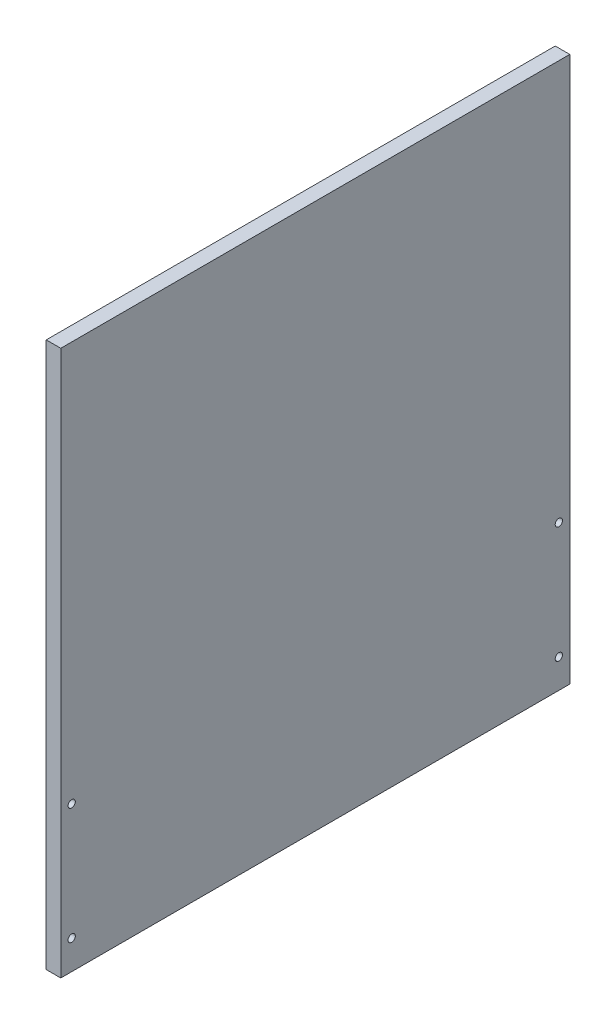
ISO-10303-21;
HEADER;
FILE_DESCRIPTION(('STEP AP214'),'2;1');
FILE_NAME('part.step','',(''),(''),'','','');
FILE_SCHEMA(('AUTOMOTIVE_DESIGN { 1 0 10303 214 1 1 1 1 }'));
ENDSEC;
DATA;
#1=APPLICATION_CONTEXT('core data for automotive mechanical design processes');
#2=APPLICATION_PROTOCOL_DEFINITION('international standard','automotive_design',2000,#1);
#3=PRODUCT_CONTEXT('',#1,'mechanical');
#4=PRODUCT('Part','Part','',(#3));
#5=PRODUCT_RELATED_PRODUCT_CATEGORY('part','',(#4));
#6=PRODUCT_DEFINITION_FORMATION('','',#4);
#7=PRODUCT_DEFINITION_CONTEXT('part definition',#1,'design');
#8=PRODUCT_DEFINITION('design','',#6,#7);
#9=PRODUCT_DEFINITION_SHAPE('','',#8);
#10=(LENGTH_UNIT() NAMED_UNIT(*) SI_UNIT(.MILLI.,.METRE.));
#11=(NAMED_UNIT(*) PLANE_ANGLE_UNIT() SI_UNIT($,.RADIAN.));
#12=(NAMED_UNIT(*) SI_UNIT($,.STERADIAN.) SOLID_ANGLE_UNIT());
#13=UNCERTAINTY_MEASURE_WITH_UNIT(LENGTH_MEASURE(1.E-05),#10,'distance_accuracy_value','');
#14=(GEOMETRIC_REPRESENTATION_CONTEXT(3) GLOBAL_UNCERTAINTY_ASSIGNED_CONTEXT((#13)) GLOBAL_UNIT_ASSIGNED_CONTEXT((#10,
#11,#12)) REPRESENTATION_CONTEXT('',''));
#15=CARTESIAN_POINT('',(0.,0.,0.));
#16=DIRECTION('',(0.,0.,1.));
#17=DIRECTION('',(1.,0.,0.));
#18=AXIS2_PLACEMENT_3D('',#15,#16,#17);
#19=CARTESIAN_POINT('',(8.,0.,0.));
#20=DIRECTION('',(-1.,0.,0.));
#21=DIRECTION('',(0.,0.,1.));
#22=AXIS2_PLACEMENT_3D('',#19,#20,#21);
#23=PLANE('',#22);
#24=CARTESIAN_POINT('',(8.,-70.,134.));
#25=DIRECTION('',(-1.,0.,0.));
#26=DIRECTION('',(0.,0.,1.));
#27=AXIS2_PLACEMENT_3D('',#24,#25,#26);
#28=CIRCLE('',#27,2.);
#29=CARTESIAN_POINT('',(8.,-70.,136.));
#30=VERTEX_POINT('',#29);
#31=EDGE_CURVE('E126',#30,#30,#28,.T.);
#32=ORIENTED_EDGE('',*,*,#31,.T.);
#33=EDGE_LOOP('',(#32));
#34=FACE_BOUND('',#33,.T.);
#35=CARTESIAN_POINT('',(8.,-134.,134.));
#36=DIRECTION('',(-1.,0.,0.));
#37=DIRECTION('',(0.,0.,1.));
#38=AXIS2_PLACEMENT_3D('',#35,#36,#37);
#39=CIRCLE('',#38,2.);
#40=CARTESIAN_POINT('',(8.,-134.,136.));
#41=VERTEX_POINT('',#40);
#42=EDGE_CURVE('E120',#41,#41,#39,.T.);
#43=ORIENTED_EDGE('',*,*,#42,.T.);
#44=EDGE_LOOP('',(#43));
#45=FACE_BOUND('',#44,.T.);
#46=CARTESIAN_POINT('',(8.,-134.,-134.));
#47=DIRECTION('',(1.,0.,0.));
#48=DIRECTION('',(0.,0.,-1.));
#49=AXIS2_PLACEMENT_3D('',#46,#47,#48);
#50=CIRCLE('',#49,2.);
#51=CARTESIAN_POINT('',(8.,-134.,-136.));
#52=VERTEX_POINT('',#51);
#53=EDGE_CURVE('E99',#52,#52,#50,.T.);
#54=ORIENTED_EDGE('',*,*,#53,.F.);
#55=EDGE_LOOP('',(#54));
#56=FACE_BOUND('',#55,.T.);
#57=DIRECTION('',(0.,1.,0.));
#58=VECTOR('',#57,1.);
#59=CARTESIAN_POINT('',(8.,-150.,-140.));
#60=LINE('',#59,#58);
#61=CARTESIAN_POINT('',(8.,-150.,-140.));
#62=VERTEX_POINT('',#61);
#63=CARTESIAN_POINT('',(8.,150.,-140.));
#64=VERTEX_POINT('',#63);
#65=EDGE_CURVE('E84',#62,#64,#60,.T.);
#66=ORIENTED_EDGE('',*,*,#65,.T.);
#67=DIRECTION('',(0.,0.,1.));
#68=VECTOR('',#67,1.);
#69=CARTESIAN_POINT('',(8.,150.,140.));
#70=LINE('',#69,#68);
#71=CARTESIAN_POINT('',(8.,150.,140.));
#72=VERTEX_POINT('',#71);
#73=EDGE_CURVE('E79',#64,#72,#70,.T.);
#74=ORIENTED_EDGE('',*,*,#73,.T.);
#75=DIRECTION('',(0.,-1.,0.));
#76=VECTOR('',#75,1.);
#77=CARTESIAN_POINT('',(8.,-150.,140.));
#78=LINE('',#77,#76);
#79=CARTESIAN_POINT('',(8.,-150.,140.));
#80=VERTEX_POINT('',#79);
#81=EDGE_CURVE('E82',#72,#80,#78,.T.);
#82=ORIENTED_EDGE('',*,*,#81,.T.);
#83=DIRECTION('',(0.,0.,-1.));
#84=VECTOR('',#83,1.);
#85=CARTESIAN_POINT('',(8.,-150.,140.));
#86=LINE('',#85,#84);
#87=EDGE_CURVE('E49',#80,#62,#86,.T.);
#88=ORIENTED_EDGE('',*,*,#87,.T.);
#89=EDGE_LOOP('',(#66,#74,#82,#88));
#90=FACE_BOUND('',#89,.T.);
#91=CARTESIAN_POINT('',(8.,-70.,-134.));
#92=DIRECTION('',(1.,0.,0.));
#93=DIRECTION('',(0.,0.,-1.));
#94=AXIS2_PLACEMENT_3D('',#91,#92,#93);
#95=CIRCLE('',#94,2.);
#96=CARTESIAN_POINT('',(8.,-70.,-136.));
#97=VERTEX_POINT('',#96);
#98=EDGE_CURVE('E114',#97,#97,#95,.T.);
#99=ORIENTED_EDGE('',*,*,#98,.F.);
#100=EDGE_LOOP('',(#99));
#101=FACE_BOUND('',#100,.T.);
#102=ADVANCED_FACE('F32',(#34,#45,#56,#90,#101),#23,.F.);
#103=CARTESIAN_POINT('',(0.,0.,0.));
#104=DIRECTION('',(-1.,0.,0.));
#105=DIRECTION('',(0.,0.,1.));
#106=AXIS2_PLACEMENT_3D('',#103,#104,#105);
#107=PLANE('',#106);
#108=CARTESIAN_POINT('',(0.,-70.,134.));
#109=DIRECTION('',(-1.,0.,0.));
#110=DIRECTION('',(0.,0.,1.));
#111=AXIS2_PLACEMENT_3D('',#108,#109,#110);
#112=CIRCLE('',#111,2.);
#113=CARTESIAN_POINT('',(0.,-70.,136.));
#114=VERTEX_POINT('',#113);
#115=EDGE_CURVE('E129',#114,#114,#112,.T.);
#116=ORIENTED_EDGE('',*,*,#115,.F.);
#117=EDGE_LOOP('',(#116));
#118=FACE_BOUND('',#117,.T.);
#119=CARTESIAN_POINT('',(0.,-134.,134.));
#120=DIRECTION('',(-1.,0.,0.));
#121=DIRECTION('',(0.,0.,1.));
#122=AXIS2_PLACEMENT_3D('',#119,#120,#121);
#123=CIRCLE('',#122,2.);
#124=CARTESIAN_POINT('',(0.,-134.,136.));
#125=VERTEX_POINT('',#124);
#126=EDGE_CURVE('E123',#125,#125,#123,.T.);
#127=ORIENTED_EDGE('',*,*,#126,.F.);
#128=EDGE_LOOP('',(#127));
#129=FACE_BOUND('',#128,.T.);
#130=CARTESIAN_POINT('',(0.,-134.,-134.));
#131=DIRECTION('',(1.,0.,0.));
#132=DIRECTION('',(0.,0.,-1.));
#133=AXIS2_PLACEMENT_3D('',#130,#131,#132);
#134=CIRCLE('',#133,2.);
#135=CARTESIAN_POINT('',(0.,-134.,-136.));
#136=VERTEX_POINT('',#135);
#137=EDGE_CURVE('E111',#136,#136,#134,.T.);
#138=ORIENTED_EDGE('',*,*,#137,.T.);
#139=EDGE_LOOP('',(#138));
#140=FACE_BOUND('',#139,.T.);
#141=DIRECTION('',(0.,1.,0.));
#142=VECTOR('',#141,1.);
#143=CARTESIAN_POINT('',(0.,-150.,-140.));
#144=LINE('',#143,#142);
#145=CARTESIAN_POINT('',(0.,-150.,-140.));
#146=VERTEX_POINT('',#145);
#147=CARTESIAN_POINT('',(0.,150.,-140.));
#148=VERTEX_POINT('',#147);
#149=EDGE_CURVE('E96',#146,#148,#144,.T.);
#150=ORIENTED_EDGE('',*,*,#149,.F.);
#151=DIRECTION('',(0.,0.,-1.));
#152=VECTOR('',#151,1.);
#153=CARTESIAN_POINT('',(0.,-150.,140.));
#154=LINE('',#153,#152);
#155=CARTESIAN_POINT('',(0.,-150.,140.));
#156=VERTEX_POINT('',#155);
#157=EDGE_CURVE('E72',#156,#146,#154,.T.);
#158=ORIENTED_EDGE('',*,*,#157,.F.);
#159=DIRECTION('',(0.,-1.,0.));
#160=VECTOR('',#159,1.);
#161=CARTESIAN_POINT('',(0.,-150.,140.));
#162=LINE('',#161,#160);
#163=CARTESIAN_POINT('',(0.,150.,140.));
#164=VERTEX_POINT('',#163);
#165=EDGE_CURVE('E66',#164,#156,#162,.T.);
#166=ORIENTED_EDGE('',*,*,#165,.F.);
#167=DIRECTION('',(0.,0.,1.));
#168=VECTOR('',#167,1.);
#169=CARTESIAN_POINT('',(0.,150.,140.));
#170=LINE('',#169,#168);
#171=EDGE_CURVE('E88',#148,#164,#170,.T.);
#172=ORIENTED_EDGE('',*,*,#171,.F.);
#173=EDGE_LOOP('',(#150,#158,#166,#172));
#174=FACE_BOUND('',#173,.T.);
#175=CARTESIAN_POINT('',(0.,-70.,-134.));
#176=DIRECTION('',(1.,0.,0.));
#177=DIRECTION('',(0.,0.,-1.));
#178=AXIS2_PLACEMENT_3D('',#175,#176,#177);
#179=CIRCLE('',#178,2.);
#180=CARTESIAN_POINT('',(0.,-70.,-136.));
#181=VERTEX_POINT('',#180);
#182=EDGE_CURVE('E117',#181,#181,#179,.T.);
#183=ORIENTED_EDGE('',*,*,#182,.T.);
#184=EDGE_LOOP('',(#183));
#185=FACE_BOUND('',#184,.T.);
#186=ADVANCED_FACE('F107',(#118,#129,#140,#174,#185),#107,.T.);
#187=CARTESIAN_POINT('',(8.,-150.,-140.));
#188=DIRECTION('',(0.,0.,1.));
#189=DIRECTION('',(1.,0.,0.));
#190=AXIS2_PLACEMENT_3D('',#187,#188,#189);
#191=PLANE('',#190);
#192=ORIENTED_EDGE('',*,*,#149,.T.);
#193=DIRECTION('',(-1.,0.,0.));
#194=VECTOR('',#193,1.);
#195=CARTESIAN_POINT('',(8.,150.,-140.));
#196=LINE('',#195,#194);
#197=EDGE_CURVE('E11',#64,#148,#196,.T.);
#198=ORIENTED_EDGE('',*,*,#197,.F.);
#199=ORIENTED_EDGE('',*,*,#65,.F.);
#200=DIRECTION('',(-1.,0.,0.));
#201=VECTOR('',#200,1.);
#202=CARTESIAN_POINT('',(8.,-150.,-140.));
#203=LINE('',#202,#201);
#204=EDGE_CURVE('E92',#62,#146,#203,.T.);
#205=ORIENTED_EDGE('',*,*,#204,.T.);
#206=EDGE_LOOP('',(#192,#198,#199,#205));
#207=FACE_BOUND('',#206,.T.);
#208=ADVANCED_FACE('F34',(#207),#191,.F.);
#209=CARTESIAN_POINT('',(8.,150.,140.));
#210=DIRECTION('',(0.,-1.,0.));
#211=DIRECTION('',(0.,0.,-1.));
#212=AXIS2_PLACEMENT_3D('',#209,#210,#211);
#213=PLANE('',#212);
#214=ORIENTED_EDGE('',*,*,#171,.T.);
#215=DIRECTION('',(-1.,0.,0.));
#216=VECTOR('',#215,1.);
#217=CARTESIAN_POINT('',(8.,150.,140.));
#218=LINE('',#217,#216);
#219=EDGE_CURVE('E41',#72,#164,#218,.T.);
#220=ORIENTED_EDGE('',*,*,#219,.F.);
#221=ORIENTED_EDGE('',*,*,#73,.F.);
#222=ORIENTED_EDGE('',*,*,#197,.T.);
#223=EDGE_LOOP('',(#214,#220,#221,#222));
#224=FACE_BOUND('',#223,.T.);
#225=ADVANCED_FACE('F87',(#224),#213,.F.);
#226=CARTESIAN_POINT('',(8.,-150.,140.));
#227=DIRECTION('',(0.,0.,-1.));
#228=DIRECTION('',(-1.,0.,0.));
#229=AXIS2_PLACEMENT_3D('',#226,#227,#228);
#230=PLANE('',#229);
#231=ORIENTED_EDGE('',*,*,#165,.T.);
#232=DIRECTION('',(-1.,0.,0.));
#233=VECTOR('',#232,1.);
#234=CARTESIAN_POINT('',(8.,-150.,140.));
#235=LINE('',#234,#233);
#236=EDGE_CURVE('E89',#80,#156,#235,.T.);
#237=ORIENTED_EDGE('',*,*,#236,.F.);
#238=ORIENTED_EDGE('',*,*,#81,.F.);
#239=ORIENTED_EDGE('',*,*,#219,.T.);
#240=EDGE_LOOP('',(#231,#237,#238,#239));
#241=FACE_BOUND('',#240,.T.);
#242=ADVANCED_FACE('F90',(#241),#230,.F.);
#243=CARTESIAN_POINT('',(8.,-150.,140.));
#244=DIRECTION('',(0.,1.,0.));
#245=DIRECTION('',(0.,0.,1.));
#246=AXIS2_PLACEMENT_3D('',#243,#244,#245);
#247=PLANE('',#246);
#248=ORIENTED_EDGE('',*,*,#157,.T.);
#249=ORIENTED_EDGE('',*,*,#204,.F.);
#250=ORIENTED_EDGE('',*,*,#87,.F.);
#251=ORIENTED_EDGE('',*,*,#236,.T.);
#252=EDGE_LOOP('',(#248,#249,#250,#251));
#253=FACE_BOUND('',#252,.T.);
#254=ADVANCED_FACE('F104',(#253),#247,.F.);
#255=CARTESIAN_POINT('',(8.,-134.,-134.));
#256=DIRECTION('',(-1.,0.,0.));
#257=DIRECTION('',(0.,0.,1.));
#258=AXIS2_PLACEMENT_3D('',#255,#256,#257);
#259=CYLINDRICAL_SURFACE('',#258,2.);
#260=ORIENTED_EDGE('',*,*,#53,.T.);
#261=EDGE_LOOP('',(#260));
#262=FACE_BOUND('',#261,.T.);
#263=ORIENTED_EDGE('',*,*,#137,.F.);
#264=EDGE_LOOP('',(#263));
#265=FACE_BOUND('',#264,.T.);
#266=ADVANCED_FACE('F151',(#262,#265),#259,.F.);
#267=CARTESIAN_POINT('',(8.,-70.,-134.));
#268=DIRECTION('',(-1.,0.,0.));
#269=DIRECTION('',(0.,0.,1.));
#270=AXIS2_PLACEMENT_3D('',#267,#268,#269);
#271=CYLINDRICAL_SURFACE('',#270,2.);
#272=ORIENTED_EDGE('',*,*,#98,.T.);
#273=EDGE_LOOP('',(#272));
#274=FACE_BOUND('',#273,.T.);
#275=ORIENTED_EDGE('',*,*,#182,.F.);
#276=EDGE_LOOP('',(#275));
#277=FACE_BOUND('',#276,.T.);
#278=ADVANCED_FACE('F153',(#274,#277),#271,.F.);
#279=CARTESIAN_POINT('',(8.,-134.,134.));
#280=DIRECTION('',(-1.,0.,0.));
#281=DIRECTION('',(0.,0.,1.));
#282=AXIS2_PLACEMENT_3D('',#279,#280,#281);
#283=CYLINDRICAL_SURFACE('',#282,2.);
#284=ORIENTED_EDGE('',*,*,#42,.F.);
#285=EDGE_LOOP('',(#284));
#286=FACE_BOUND('',#285,.T.);
#287=ORIENTED_EDGE('',*,*,#126,.T.);
#288=EDGE_LOOP('',(#287));
#289=FACE_BOUND('',#288,.T.);
#290=ADVANCED_FACE('F140',(#286,#289),#283,.F.);
#291=CARTESIAN_POINT('',(8.,-70.,134.));
#292=DIRECTION('',(-1.,0.,0.));
#293=DIRECTION('',(0.,0.,1.));
#294=AXIS2_PLACEMENT_3D('',#291,#292,#293);
#295=CYLINDRICAL_SURFACE('',#294,2.);
#296=ORIENTED_EDGE('',*,*,#31,.F.);
#297=EDGE_LOOP('',(#296));
#298=FACE_BOUND('',#297,.T.);
#299=ORIENTED_EDGE('',*,*,#115,.T.);
#300=EDGE_LOOP('',(#299));
#301=FACE_BOUND('',#300,.T.);
#302=ADVANCED_FACE('F137',(#298,#301),#295,.F.);
#303=CLOSED_SHELL('',(#102,#186,#208,#225,#242,#254,#266,#278,#290,#302));
#304=MANIFOLD_SOLID_BREP('B2',#303);
#305=ADVANCED_BREP_SHAPE_REPRESENTATION('',(#18,#304),#14);
#306=SHAPE_DEFINITION_REPRESENTATION(#9,#305);
ENDSEC;
END-ISO-10303-21;
